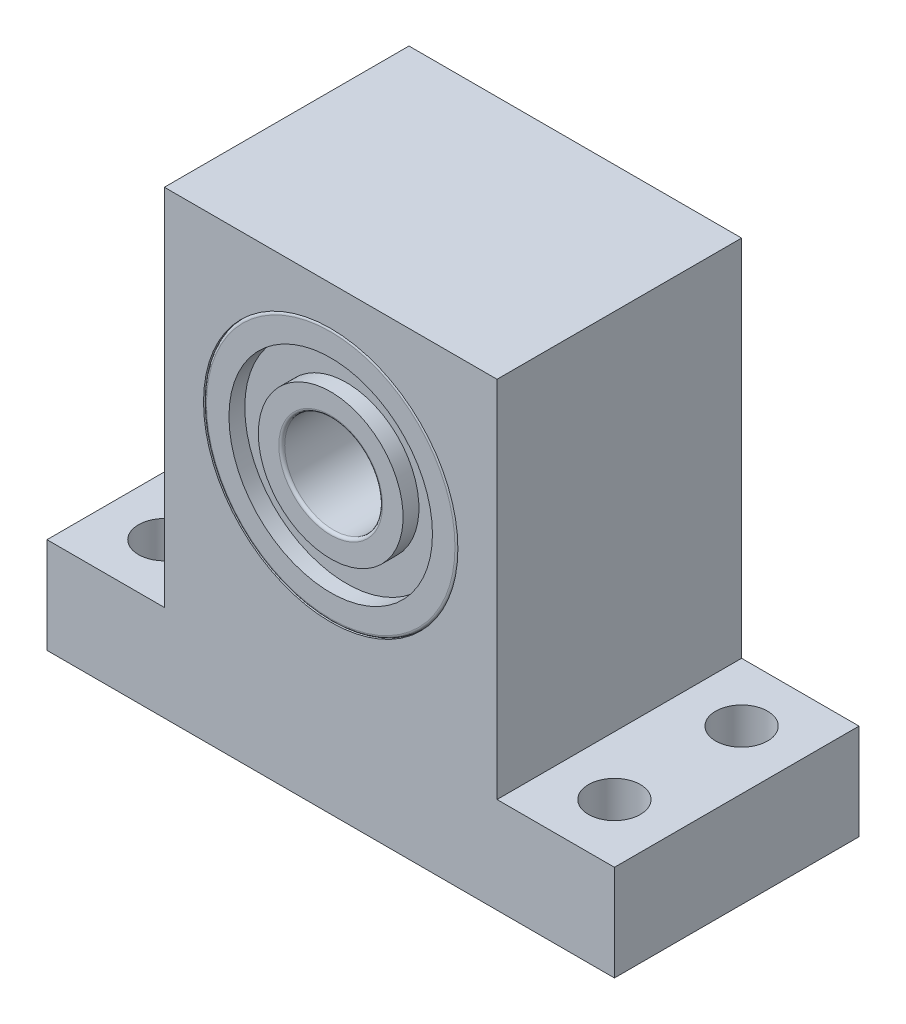
ISO-10303-21;
HEADER;
FILE_DESCRIPTION(('STEP AP214'),'2;1');
FILE_NAME('part.step','',(''),(''),'','','');
FILE_SCHEMA(('AUTOMOTIVE_DESIGN { 1 0 10303 214 1 1 1 1 }'));
ENDSEC;
DATA;
#1=APPLICATION_CONTEXT('core data for automotive mechanical design processes');
#2=APPLICATION_PROTOCOL_DEFINITION('international standard','automotive_design',2000,#1);
#3=PRODUCT_CONTEXT('',#1,'mechanical');
#4=PRODUCT('Part','Part','',(#3));
#5=PRODUCT_RELATED_PRODUCT_CATEGORY('part','',(#4));
#6=PRODUCT_DEFINITION_FORMATION('','',#4);
#7=PRODUCT_DEFINITION_CONTEXT('part definition',#1,'design');
#8=PRODUCT_DEFINITION('design','',#6,#7);
#9=PRODUCT_DEFINITION_SHAPE('','',#8);
#10=(LENGTH_UNIT() NAMED_UNIT(*) SI_UNIT(.MILLI.,.METRE.));
#11=(NAMED_UNIT(*) PLANE_ANGLE_UNIT() SI_UNIT($,.RADIAN.));
#12=(NAMED_UNIT(*) SI_UNIT($,.STERADIAN.) SOLID_ANGLE_UNIT());
#13=UNCERTAINTY_MEASURE_WITH_UNIT(LENGTH_MEASURE(1.E-05),#10,'distance_accuracy_value','');
#14=(GEOMETRIC_REPRESENTATION_CONTEXT(3) GLOBAL_UNCERTAINTY_ASSIGNED_CONTEXT((#13)) GLOBAL_UNIT_ASSIGNED_CONTEXT((#10,
#11,#12)) REPRESENTATION_CONTEXT('',''));
#15=CARTESIAN_POINT('',(0.,0.,0.));
#16=DIRECTION('',(0.,0.,1.));
#17=DIRECTION('',(1.,0.,0.));
#18=AXIS2_PLACEMENT_3D('',#15,#16,#17);
#19=CARTESIAN_POINT('',(0.,40.4,4.5));
#20=DIRECTION('',(0.,0.,-1.));
#21=DIRECTION('',(0.,-1.,0.));
#22=AXIS2_PLACEMENT_3D('',#19,#20,#21);
#23=PLANE('',#22);
#24=CARTESIAN_POINT('',(0.,30.,4.5));
#25=DIRECTION('',(0.,0.,-1.));
#26=DIRECTION('',(-1.,0.,0.));
#27=AXIS2_PLACEMENT_3D('',#24,#25,#26);
#28=CIRCLE('',#27,10.4);
#29=CARTESIAN_POINT('',(-10.4,30.,4.5));
#30=VERTEX_POINT('',#29);
#31=EDGE_CURVE('E212',#30,#30,#28,.T.);
#32=ORIENTED_EDGE('',*,*,#31,.F.);
#33=EDGE_LOOP('',(#32));
#34=FACE_BOUND('',#33,.T.);
#35=CARTESIAN_POINT('',(0.,30.,4.5));
#36=DIRECTION('',(0.,0.,-1.));
#37=DIRECTION('',(-1.,0.,0.));
#38=AXIS2_PLACEMENT_3D('',#35,#36,#37);
#39=CIRCLE('',#38,11.);
#40=CARTESIAN_POINT('',(-11.,30.,4.5));
#41=VERTEX_POINT('',#40);
#42=EDGE_CURVE('E245',#41,#41,#39,.T.);
#43=ORIENTED_EDGE('',*,*,#42,.T.);
#44=EDGE_LOOP('',(#43));
#45=FACE_BOUND('',#44,.T.);
#46=ADVANCED_FACE('F17',(#34,#45),#23,.T.);
#47=CARTESIAN_POINT('',(0.,30.,12.2));
#48=DIRECTION('',(0.,0.,-1.));
#49=DIRECTION('',(-1.,0.,0.));
#50=AXIS2_PLACEMENT_3D('',#47,#48,#49);
#51=TOROIDAL_SURFACE('',#50,12.7,0.3);
#52=CARTESIAN_POINT('',(0.,30.,12.2));
#53=DIRECTION('',(0.,0.,-1.));
#54=DIRECTION('',(-1.,0.,0.));
#55=AXIS2_PLACEMENT_3D('',#52,#53,#54);
#56=CIRCLE('',#55,13.);
#57=CARTESIAN_POINT('',(-13.,30.,12.2));
#58=VERTEX_POINT('',#57);
#59=EDGE_CURVE('E250',#58,#58,#56,.T.);
#60=ORIENTED_EDGE('',*,*,#59,.F.);
#61=EDGE_LOOP('',(#60));
#62=FACE_BOUND('',#61,.T.);
#63=CARTESIAN_POINT('',(0.,30.,12.5));
#64=DIRECTION('',(0.,0.,-1.));
#65=DIRECTION('',(-1.,0.,0.));
#66=AXIS2_PLACEMENT_3D('',#63,#64,#65);
#67=CIRCLE('',#66,12.7);
#68=CARTESIAN_POINT('',(-12.7,30.,12.5));
#69=VERTEX_POINT('',#68);
#70=EDGE_CURVE('E175',#69,#69,#67,.T.);
#71=ORIENTED_EDGE('',*,*,#70,.T.);
#72=EDGE_LOOP('',(#71));
#73=FACE_BOUND('',#72,.T.);
#74=ADVANCED_FACE('F489',(#62,#73),#51,.T.);
#75=CARTESIAN_POINT('',(0.,42.7,12.5));
#76=DIRECTION('',(0.,0.,1.));
#77=DIRECTION('',(1.,0.,0.));
#78=AXIS2_PLACEMENT_3D('',#75,#76,#77);
#79=PLANE('',#78);
#80=ORIENTED_EDGE('',*,*,#70,.F.);
#81=EDGE_LOOP('',(#80));
#82=FACE_BOUND('',#81,.T.);
#83=CARTESIAN_POINT('',(0.,30.,12.5));
#84=DIRECTION('',(0.,0.,-1.));
#85=DIRECTION('',(-1.,0.,0.));
#86=AXIS2_PLACEMENT_3D('',#83,#84,#85);
#87=CIRCLE('',#86,10.4);
#88=CARTESIAN_POINT('',(-10.4,30.,12.5));
#89=VERTEX_POINT('',#88);
#90=EDGE_CURVE('E178',#89,#89,#87,.T.);
#91=ORIENTED_EDGE('',*,*,#90,.T.);
#92=EDGE_LOOP('',(#91));
#93=FACE_BOUND('',#92,.T.);
#94=ADVANCED_FACE('F495',(#82,#93),#79,.T.);
#95=CARTESIAN_POINT('',(0.,30.,-50.));
#96=DIRECTION('',(0.,0.,-1.));
#97=DIRECTION('',(-1.,0.,0.));
#98=AXIS2_PLACEMENT_3D('',#95,#96,#97);
#99=CYLINDRICAL_SURFACE('',#98,10.4);
#100=ORIENTED_EDGE('',*,*,#90,.F.);
#101=EDGE_LOOP('',(#100));
#102=FACE_BOUND('',#101,.T.);
#103=CARTESIAN_POINT('',(0.,30.,10.882));
#104=DIRECTION('',(0.,0.,-1.));
#105=DIRECTION('',(-1.,0.,0.));
#106=AXIS2_PLACEMENT_3D('',#103,#104,#105);
#107=CIRCLE('',#106,10.4);
#108=CARTESIAN_POINT('',(-10.4,30.,10.882));
#109=VERTEX_POINT('',#108);
#110=EDGE_CURVE('E181',#109,#109,#107,.T.);
#111=ORIENTED_EDGE('',*,*,#110,.T.);
#112=EDGE_LOOP('',(#111));
#113=FACE_BOUND('',#112,.T.);
#114=ADVANCED_FACE('F555',(#102,#113),#99,.F.);
#115=CARTESIAN_POINT('',(0.,40.4,10.882));
#116=DIRECTION('',(0.,0.,1.));
#117=DIRECTION('',(1.,0.,0.));
#118=AXIS2_PLACEMENT_3D('',#115,#116,#117);
#119=PLANE('',#118);
#120=ORIENTED_EDGE('',*,*,#110,.F.);
#121=EDGE_LOOP('',(#120));
#122=FACE_BOUND('',#121,.T.);
#123=CARTESIAN_POINT('',(0.,30.,10.882));
#124=DIRECTION('',(0.,0.,-1.));
#125=DIRECTION('',(-1.,0.,0.));
#126=AXIS2_PLACEMENT_3D('',#123,#124,#125);
#127=CIRCLE('',#126,7.4);
#128=CARTESIAN_POINT('',(-7.4,30.,10.882));
#129=VERTEX_POINT('',#128);
#130=EDGE_CURVE('E182',#129,#129,#127,.T.);
#131=ORIENTED_EDGE('',*,*,#130,.T.);
#132=EDGE_LOOP('',(#131));
#133=FACE_BOUND('',#132,.T.);
#134=ADVANCED_FACE('F551',(#122,#133),#119,.T.);
#135=CARTESIAN_POINT('',(0.,30.,-50.));
#136=DIRECTION('',(0.,0.,-1.));
#137=DIRECTION('',(-1.,0.,0.));
#138=AXIS2_PLACEMENT_3D('',#135,#136,#137);
#139=CYLINDRICAL_SURFACE('',#138,7.4);
#140=ORIENTED_EDGE('',*,*,#130,.F.);
#141=EDGE_LOOP('',(#140));
#142=FACE_BOUND('',#141,.T.);
#143=CARTESIAN_POINT('',(0.,30.,12.5));
#144=DIRECTION('',(0.,0.,-1.));
#145=DIRECTION('',(-1.,0.,0.));
#146=AXIS2_PLACEMENT_3D('',#143,#144,#145);
#147=CIRCLE('',#146,7.4);
#148=CARTESIAN_POINT('',(-7.4,30.,12.5));
#149=VERTEX_POINT('',#148);
#150=EDGE_CURVE('E185',#149,#149,#147,.T.);
#151=ORIENTED_EDGE('',*,*,#150,.T.);
#152=EDGE_LOOP('',(#151));
#153=FACE_BOUND('',#152,.T.);
#154=ADVANCED_FACE('F554',(#142,#153),#139,.T.);
#155=CARTESIAN_POINT('',(0.,37.4,12.5));
#156=DIRECTION('',(0.,0.,1.));
#157=DIRECTION('',(1.,0.,0.));
#158=AXIS2_PLACEMENT_3D('',#155,#156,#157);
#159=PLANE('',#158);
#160=ORIENTED_EDGE('',*,*,#150,.F.);
#161=EDGE_LOOP('',(#160));
#162=FACE_BOUND('',#161,.T.);
#163=CARTESIAN_POINT('',(0.,30.,12.5));
#164=DIRECTION('',(0.,0.,-1.));
#165=DIRECTION('',(-1.,0.,0.));
#166=AXIS2_PLACEMENT_3D('',#163,#164,#165);
#167=CIRCLE('',#166,5.3);
#168=CARTESIAN_POINT('',(-5.3,30.,12.5));
#169=VERTEX_POINT('',#168);
#170=EDGE_CURVE('E189',#169,#169,#167,.T.);
#171=ORIENTED_EDGE('',*,*,#170,.T.);
#172=EDGE_LOOP('',(#171));
#173=FACE_BOUND('',#172,.T.);
#174=ADVANCED_FACE('F571',(#162,#173),#159,.T.);
#175=CARTESIAN_POINT('',(0.,30.,12.2));
#176=DIRECTION('',(0.,0.,-1.));
#177=DIRECTION('',(-1.,0.,0.));
#178=AXIS2_PLACEMENT_3D('',#175,#176,#177);
#179=TOROIDAL_SURFACE('',#178,5.3,0.299999999999991);
#180=ORIENTED_EDGE('',*,*,#170,.F.);
#181=EDGE_LOOP('',(#180));
#182=FACE_BOUND('',#181,.T.);
#183=CARTESIAN_POINT('',(0.,30.,12.2));
#184=DIRECTION('',(0.,0.,-1.));
#185=DIRECTION('',(-1.,0.,0.));
#186=AXIS2_PLACEMENT_3D('',#183,#184,#185);
#187=CIRCLE('',#186,5.);
#188=CARTESIAN_POINT('',(-5.,30.,12.2));
#189=VERTEX_POINT('',#188);
#190=EDGE_CURVE('E192',#189,#189,#187,.T.);
#191=ORIENTED_EDGE('',*,*,#190,.T.);
#192=EDGE_LOOP('',(#191));
#193=FACE_BOUND('',#192,.T.);
#194=ADVANCED_FACE('F567',(#182,#193),#179,.T.);
#195=CARTESIAN_POINT('',(0.,30.,-50.));
#196=DIRECTION('',(0.,0.,-1.));
#197=DIRECTION('',(-1.,0.,0.));
#198=AXIS2_PLACEMENT_3D('',#195,#196,#197);
#199=CYLINDRICAL_SURFACE('',#198,5.);
#200=ORIENTED_EDGE('',*,*,#190,.F.);
#201=EDGE_LOOP('',(#200));
#202=FACE_BOUND('',#201,.T.);
#203=CARTESIAN_POINT('',(0.,30.,4.8));
#204=DIRECTION('',(0.,0.,-1.));
#205=DIRECTION('',(-1.,0.,0.));
#206=AXIS2_PLACEMENT_3D('',#203,#204,#205);
#207=CIRCLE('',#206,5.);
#208=CARTESIAN_POINT('',(-5.,30.,4.8));
#209=VERTEX_POINT('',#208);
#210=EDGE_CURVE('E196',#209,#209,#207,.T.);
#211=ORIENTED_EDGE('',*,*,#210,.T.);
#212=EDGE_LOOP('',(#211));
#213=FACE_BOUND('',#212,.T.);
#214=ADVANCED_FACE('F563',(#202,#213),#199,.F.);
#215=CARTESIAN_POINT('',(0.,30.,4.8));
#216=DIRECTION('',(0.,0.,-1.));
#217=DIRECTION('',(-1.,0.,0.));
#218=AXIS2_PLACEMENT_3D('',#215,#216,#217);
#219=TOROIDAL_SURFACE('',#218,5.3,0.299999999999988);
#220=ORIENTED_EDGE('',*,*,#210,.F.);
#221=EDGE_LOOP('',(#220));
#222=FACE_BOUND('',#221,.T.);
#223=CARTESIAN_POINT('',(0.,30.,4.5));
#224=DIRECTION('',(0.,0.,-1.));
#225=DIRECTION('',(-1.,0.,0.));
#226=AXIS2_PLACEMENT_3D('',#223,#224,#225);
#227=CIRCLE('',#226,5.3);
#228=CARTESIAN_POINT('',(-5.3,30.,4.5));
#229=VERTEX_POINT('',#228);
#230=EDGE_CURVE('E199',#229,#229,#227,.T.);
#231=ORIENTED_EDGE('',*,*,#230,.T.);
#232=EDGE_LOOP('',(#231));
#233=FACE_BOUND('',#232,.T.);
#234=ADVANCED_FACE('F559',(#222,#233),#219,.T.);
#235=CARTESIAN_POINT('',(0.,35.3,4.5));
#236=DIRECTION('',(0.,0.,-1.));
#237=DIRECTION('',(0.,-1.,0.));
#238=AXIS2_PLACEMENT_3D('',#235,#236,#237);
#239=PLANE('',#238);
#240=ORIENTED_EDGE('',*,*,#230,.F.);
#241=EDGE_LOOP('',(#240));
#242=FACE_BOUND('',#241,.T.);
#243=CARTESIAN_POINT('',(0.,30.,4.5));
#244=DIRECTION('',(0.,0.,-1.));
#245=DIRECTION('',(-1.,0.,0.));
#246=AXIS2_PLACEMENT_3D('',#243,#244,#245);
#247=CIRCLE('',#246,7.4);
#248=CARTESIAN_POINT('',(-7.4,30.,4.5));
#249=VERTEX_POINT('',#248);
#250=EDGE_CURVE('E203',#249,#249,#247,.T.);
#251=ORIENTED_EDGE('',*,*,#250,.T.);
#252=EDGE_LOOP('',(#251));
#253=FACE_BOUND('',#252,.T.);
#254=ADVANCED_FACE('F549',(#242,#253),#239,.T.);
#255=CARTESIAN_POINT('',(0.,30.,-50.));
#256=DIRECTION('',(0.,0.,-1.));
#257=DIRECTION('',(-1.,0.,0.));
#258=AXIS2_PLACEMENT_3D('',#255,#256,#257);
#259=CYLINDRICAL_SURFACE('',#258,7.4);
#260=ORIENTED_EDGE('',*,*,#250,.F.);
#261=EDGE_LOOP('',(#260));
#262=FACE_BOUND('',#261,.T.);
#263=CARTESIAN_POINT('',(0.,30.,6.119));
#264=DIRECTION('',(0.,0.,-1.));
#265=DIRECTION('',(-1.,0.,0.));
#266=AXIS2_PLACEMENT_3D('',#263,#264,#265);
#267=CIRCLE('',#266,7.4);
#268=CARTESIAN_POINT('',(-7.4,30.,6.119));
#269=VERTEX_POINT('',#268);
#270=EDGE_CURVE('E206',#269,#269,#267,.T.);
#271=ORIENTED_EDGE('',*,*,#270,.T.);
#272=EDGE_LOOP('',(#271));
#273=FACE_BOUND('',#272,.T.);
#274=ADVANCED_FACE('F545',(#262,#273),#259,.T.);
#275=CARTESIAN_POINT('',(0.,37.4,6.119));
#276=DIRECTION('',(0.,0.,-1.));
#277=DIRECTION('',(0.,-1.,0.));
#278=AXIS2_PLACEMENT_3D('',#275,#276,#277);
#279=PLANE('',#278);
#280=ORIENTED_EDGE('',*,*,#270,.F.);
#281=EDGE_LOOP('',(#280));
#282=FACE_BOUND('',#281,.T.);
#283=CARTESIAN_POINT('',(0.,30.,6.119));
#284=DIRECTION('',(0.,0.,-1.));
#285=DIRECTION('',(-1.,0.,0.));
#286=AXIS2_PLACEMENT_3D('',#283,#284,#285);
#287=CIRCLE('',#286,10.4);
#288=CARTESIAN_POINT('',(-10.4,30.,6.119));
#289=VERTEX_POINT('',#288);
#290=EDGE_CURVE('E209',#289,#289,#287,.T.);
#291=ORIENTED_EDGE('',*,*,#290,.T.);
#292=EDGE_LOOP('',(#291));
#293=FACE_BOUND('',#292,.T.);
#294=ADVANCED_FACE('F541',(#282,#293),#279,.T.);
#295=CARTESIAN_POINT('',(0.,30.,-50.));
#296=DIRECTION('',(0.,0.,-1.));
#297=DIRECTION('',(-1.,0.,0.));
#298=AXIS2_PLACEMENT_3D('',#295,#296,#297);
#299=CYLINDRICAL_SURFACE('',#298,10.4);
#300=ORIENTED_EDGE('',*,*,#290,.F.);
#301=EDGE_LOOP('',(#300));
#302=FACE_BOUND('',#301,.T.);
#303=ORIENTED_EDGE('',*,*,#31,.T.);
#304=EDGE_LOOP('',(#303));
#305=FACE_BOUND('',#304,.T.);
#306=ADVANCED_FACE('F537',(#302,#305),#299,.F.);
#307=CARTESIAN_POINT('',(0.,30.,-50.));
#308=DIRECTION('',(0.,0.,-1.));
#309=DIRECTION('',(-1.,0.,0.));
#310=AXIS2_PLACEMENT_3D('',#307,#308,#309);
#311=CYLINDRICAL_SURFACE('',#310,7.4);
#312=CARTESIAN_POINT('',(0.,30.,-6.119));
#313=DIRECTION('',(0.,0.,-1.));
#314=DIRECTION('',(-1.,0.,0.));
#315=AXIS2_PLACEMENT_3D('',#312,#313,#314);
#316=CIRCLE('',#315,7.4);
#317=CARTESIAN_POINT('',(-7.4,30.,-6.119));
#318=VERTEX_POINT('',#317);
#319=EDGE_CURVE('E215',#318,#318,#316,.T.);
#320=ORIENTED_EDGE('',*,*,#319,.F.);
#321=EDGE_LOOP('',(#320));
#322=FACE_BOUND('',#321,.T.);
#323=CARTESIAN_POINT('',(0.,30.,-4.5));
#324=DIRECTION('',(0.,0.,-1.));
#325=DIRECTION('',(-1.,0.,0.));
#326=AXIS2_PLACEMENT_3D('',#323,#324,#325);
#327=CIRCLE('',#326,7.4);
#328=CARTESIAN_POINT('',(-7.4,30.,-4.5));
#329=VERTEX_POINT('',#328);
#330=EDGE_CURVE('E236',#329,#329,#327,.T.);
#331=ORIENTED_EDGE('',*,*,#330,.T.);
#332=EDGE_LOOP('',(#331));
#333=FACE_BOUND('',#332,.T.);
#334=ADVANCED_FACE('F540',(#322,#333),#311,.T.);
#335=CARTESIAN_POINT('',(0.,40.4,-6.119));
#336=DIRECTION('',(0.,0.,1.));
#337=DIRECTION('',(1.,0.,0.));
#338=AXIS2_PLACEMENT_3D('',#335,#336,#337);
#339=PLANE('',#338);
#340=CARTESIAN_POINT('',(0.,30.,-6.119));
#341=DIRECTION('',(0.,0.,-1.));
#342=DIRECTION('',(-1.,0.,0.));
#343=AXIS2_PLACEMENT_3D('',#340,#341,#342);
#344=CIRCLE('',#343,10.4);
#345=CARTESIAN_POINT('',(-10.4,30.,-6.119));
#346=VERTEX_POINT('',#345);
#347=EDGE_CURVE('E218',#346,#346,#344,.T.);
#348=ORIENTED_EDGE('',*,*,#347,.F.);
#349=EDGE_LOOP('',(#348));
#350=FACE_BOUND('',#349,.T.);
#351=ORIENTED_EDGE('',*,*,#319,.T.);
#352=EDGE_LOOP('',(#351));
#353=FACE_BOUND('',#352,.T.);
#354=ADVANCED_FACE('F535',(#350,#353),#339,.T.);
#355=CARTESIAN_POINT('',(0.,30.,-50.));
#356=DIRECTION('',(0.,0.,-1.));
#357=DIRECTION('',(-1.,0.,0.));
#358=AXIS2_PLACEMENT_3D('',#355,#356,#357);
#359=CYLINDRICAL_SURFACE('',#358,10.4);
#360=CARTESIAN_POINT('',(0.,30.,-4.5));
#361=DIRECTION('',(0.,0.,-1.));
#362=DIRECTION('',(-1.,0.,0.));
#363=AXIS2_PLACEMENT_3D('',#360,#361,#362);
#364=CIRCLE('',#363,10.4);
#365=CARTESIAN_POINT('',(-10.4,30.,-4.5));
#366=VERTEX_POINT('',#365);
#367=EDGE_CURVE('E242',#366,#366,#364,.T.);
#368=ORIENTED_EDGE('',*,*,#367,.F.);
#369=EDGE_LOOP('',(#368));
#370=FACE_BOUND('',#369,.T.);
#371=ORIENTED_EDGE('',*,*,#347,.T.);
#372=EDGE_LOOP('',(#371));
#373=FACE_BOUND('',#372,.T.);
#374=ADVANCED_FACE('F451',(#370,#373),#359,.F.);
#375=CARTESIAN_POINT('',(0.,30.,-12.2));
#376=DIRECTION('',(0.,0.,-1.));
#377=DIRECTION('',(-1.,0.,0.));
#378=AXIS2_PLACEMENT_3D('',#375,#376,#377);
#379=TOROIDAL_SURFACE('',#378,12.7,0.3);
#380=CARTESIAN_POINT('',(0.,30.,-12.5));
#381=DIRECTION('',(0.,0.,-1.));
#382=DIRECTION('',(-1.,0.,0.));
#383=AXIS2_PLACEMENT_3D('',#380,#381,#382);
#384=CIRCLE('',#383,12.7);
#385=CARTESIAN_POINT('',(-12.7,30.,-12.5));
#386=VERTEX_POINT('',#385);
#387=EDGE_CURVE('E222',#386,#386,#384,.T.);
#388=ORIENTED_EDGE('',*,*,#387,.F.);
#389=EDGE_LOOP('',(#388));
#390=FACE_BOUND('',#389,.T.);
#391=CARTESIAN_POINT('',(0.,30.,-12.2));
#392=DIRECTION('',(0.,0.,-1.));
#393=DIRECTION('',(-1.,0.,0.));
#394=AXIS2_PLACEMENT_3D('',#391,#392,#393);
#395=CIRCLE('',#394,13.);
#396=CARTESIAN_POINT('',(-13.,30.,-12.2));
#397=VERTEX_POINT('',#396);
#398=EDGE_CURVE('E394',#397,#397,#395,.T.);
#399=ORIENTED_EDGE('',*,*,#398,.T.);
#400=EDGE_LOOP('',(#399));
#401=FACE_BOUND('',#400,.T.);
#402=ADVANCED_FACE('F445',(#390,#401),#379,.T.);
#403=CARTESIAN_POINT('',(0.,40.4,-12.5));
#404=DIRECTION('',(0.,0.,-1.));
#405=DIRECTION('',(0.,-1.,0.));
#406=AXIS2_PLACEMENT_3D('',#403,#404,#405);
#407=PLANE('',#406);
#408=CARTESIAN_POINT('',(0.,30.,-12.5));
#409=DIRECTION('',(0.,0.,-1.));
#410=DIRECTION('',(-1.,0.,0.));
#411=AXIS2_PLACEMENT_3D('',#408,#409,#410);
#412=CIRCLE('',#411,10.4);
#413=CARTESIAN_POINT('',(-10.4,30.,-12.5));
#414=VERTEX_POINT('',#413);
#415=EDGE_CURVE('E219',#414,#414,#412,.T.);
#416=ORIENTED_EDGE('',*,*,#415,.F.);
#417=EDGE_LOOP('',(#416));
#418=FACE_BOUND('',#417,.T.);
#419=ORIENTED_EDGE('',*,*,#387,.T.);
#420=EDGE_LOOP('',(#419));
#421=FACE_BOUND('',#420,.T.);
#422=ADVANCED_FACE('F439',(#418,#421),#407,.T.);
#423=CARTESIAN_POINT('',(0.,30.,-50.));
#424=DIRECTION('',(0.,0.,-1.));
#425=DIRECTION('',(-1.,0.,0.));
#426=AXIS2_PLACEMENT_3D('',#423,#424,#425);
#427=CYLINDRICAL_SURFACE('',#426,10.4);
#428=CARTESIAN_POINT('',(0.,30.,-10.882));
#429=DIRECTION('',(0.,0.,-1.));
#430=DIRECTION('',(-1.,0.,0.));
#431=AXIS2_PLACEMENT_3D('',#428,#429,#430);
#432=CIRCLE('',#431,10.4);
#433=CARTESIAN_POINT('',(-10.4,30.,-10.882));
#434=VERTEX_POINT('',#433);
#435=EDGE_CURVE('E223',#434,#434,#432,.T.);
#436=ORIENTED_EDGE('',*,*,#435,.F.);
#437=EDGE_LOOP('',(#436));
#438=FACE_BOUND('',#437,.T.);
#439=ORIENTED_EDGE('',*,*,#415,.T.);
#440=EDGE_LOOP('',(#439));
#441=FACE_BOUND('',#440,.T.);
#442=ADVANCED_FACE('F433',(#438,#441),#427,.F.);
#443=CARTESIAN_POINT('',(0.,37.4,-10.882));
#444=DIRECTION('',(0.,0.,-1.));
#445=DIRECTION('',(0.,-1.,0.));
#446=AXIS2_PLACEMENT_3D('',#443,#444,#445);
#447=PLANE('',#446);
#448=CARTESIAN_POINT('',(0.,30.,-10.882));
#449=DIRECTION('',(0.,0.,-1.));
#450=DIRECTION('',(-1.,0.,0.));
#451=AXIS2_PLACEMENT_3D('',#448,#449,#450);
#452=CIRCLE('',#451,7.4);
#453=CARTESIAN_POINT('',(-7.4,30.,-10.882));
#454=VERTEX_POINT('',#453);
#455=EDGE_CURVE('E229',#454,#454,#452,.T.);
#456=ORIENTED_EDGE('',*,*,#455,.F.);
#457=EDGE_LOOP('',(#456));
#458=FACE_BOUND('',#457,.T.);
#459=ORIENTED_EDGE('',*,*,#435,.T.);
#460=EDGE_LOOP('',(#459));
#461=FACE_BOUND('',#460,.T.);
#462=ADVANCED_FACE('F427',(#458,#461),#447,.T.);
#463=CARTESIAN_POINT('',(0.,30.,-50.));
#464=DIRECTION('',(0.,0.,-1.));
#465=DIRECTION('',(-1.,0.,0.));
#466=AXIS2_PLACEMENT_3D('',#463,#464,#465);
#467=CYLINDRICAL_SURFACE('',#466,7.4);
#468=CARTESIAN_POINT('',(0.,30.,-12.5));
#469=DIRECTION('',(0.,0.,-1.));
#470=DIRECTION('',(-1.,0.,0.));
#471=AXIS2_PLACEMENT_3D('',#468,#469,#470);
#472=CIRCLE('',#471,7.4);
#473=CARTESIAN_POINT('',(-7.4,30.,-12.5));
#474=VERTEX_POINT('',#473);
#475=EDGE_CURVE('E226',#474,#474,#472,.T.);
#476=ORIENTED_EDGE('',*,*,#475,.F.);
#477=EDGE_LOOP('',(#476));
#478=FACE_BOUND('',#477,.T.);
#479=ORIENTED_EDGE('',*,*,#455,.T.);
#480=EDGE_LOOP('',(#479));
#481=FACE_BOUND('',#480,.T.);
#482=ADVANCED_FACE('F421',(#478,#481),#467,.T.);
#483=CARTESIAN_POINT('',(0.,35.3,-12.5));
#484=DIRECTION('',(0.,0.,-1.));
#485=DIRECTION('',(0.,-1.,0.));
#486=AXIS2_PLACEMENT_3D('',#483,#484,#485);
#487=PLANE('',#486);
#488=CARTESIAN_POINT('',(0.,30.,-12.5));
#489=DIRECTION('',(0.,0.,-1.));
#490=DIRECTION('',(-1.,0.,0.));
#491=AXIS2_PLACEMENT_3D('',#488,#489,#490);
#492=CIRCLE('',#491,5.3);
#493=CARTESIAN_POINT('',(-5.3,30.,-12.5));
#494=VERTEX_POINT('',#493);
#495=EDGE_CURVE('E230',#494,#494,#492,.T.);
#496=ORIENTED_EDGE('',*,*,#495,.F.);
#497=EDGE_LOOP('',(#496));
#498=FACE_BOUND('',#497,.T.);
#499=ORIENTED_EDGE('',*,*,#475,.T.);
#500=EDGE_LOOP('',(#499));
#501=FACE_BOUND('',#500,.T.);
#502=ADVANCED_FACE('F415',(#498,#501),#487,.T.);
#503=CARTESIAN_POINT('',(0.,30.,-12.2));
#504=DIRECTION('',(0.,0.,-1.));
#505=DIRECTION('',(-1.,0.,0.));
#506=AXIS2_PLACEMENT_3D('',#503,#504,#505);
#507=TOROIDAL_SURFACE('',#506,5.3,0.299999999999988);
#508=CARTESIAN_POINT('',(0.,30.,-12.2));
#509=DIRECTION('',(0.,0.,-1.));
#510=DIRECTION('',(-1.,0.,0.));
#511=AXIS2_PLACEMENT_3D('',#508,#509,#510);
#512=CIRCLE('',#511,5.);
#513=CARTESIAN_POINT('',(-5.,30.,-12.2));
#514=VERTEX_POINT('',#513);
#515=EDGE_CURVE('E235',#514,#514,#512,.T.);
#516=ORIENTED_EDGE('',*,*,#515,.F.);
#517=EDGE_LOOP('',(#516));
#518=FACE_BOUND('',#517,.T.);
#519=ORIENTED_EDGE('',*,*,#495,.T.);
#520=EDGE_LOOP('',(#519));
#521=FACE_BOUND('',#520,.T.);
#522=ADVANCED_FACE('F412',(#518,#521),#507,.T.);
#523=CARTESIAN_POINT('',(0.,30.,-50.));
#524=DIRECTION('',(0.,0.,-1.));
#525=DIRECTION('',(-1.,0.,0.));
#526=AXIS2_PLACEMENT_3D('',#523,#524,#525);
#527=CYLINDRICAL_SURFACE('',#526,5.);
#528=CARTESIAN_POINT('',(0.,30.,-4.8));
#529=DIRECTION('',(0.,0.,-1.));
#530=DIRECTION('',(-1.,0.,0.));
#531=AXIS2_PLACEMENT_3D('',#528,#529,#530);
#532=CIRCLE('',#531,5.);
#533=CARTESIAN_POINT('',(-5.,30.,-4.8));
#534=VERTEX_POINT('',#533);
#535=EDGE_CURVE('E231',#534,#534,#532,.T.);
#536=ORIENTED_EDGE('',*,*,#535,.F.);
#537=EDGE_LOOP('',(#536));
#538=FACE_BOUND('',#537,.T.);
#539=ORIENTED_EDGE('',*,*,#515,.T.);
#540=EDGE_LOOP('',(#539));
#541=FACE_BOUND('',#540,.T.);
#542=ADVANCED_FACE('F410',(#538,#541),#527,.F.);
#543=CARTESIAN_POINT('',(0.,30.,-4.8));
#544=DIRECTION('',(0.,0.,-1.));
#545=DIRECTION('',(-1.,0.,0.));
#546=AXIS2_PLACEMENT_3D('',#543,#544,#545);
#547=TOROIDAL_SURFACE('',#546,5.3,0.299999999999987);
#548=CARTESIAN_POINT('',(0.,30.,-4.5));
#549=DIRECTION('',(0.,0.,-1.));
#550=DIRECTION('',(-1.,0.,0.));
#551=AXIS2_PLACEMENT_3D('',#548,#549,#550);
#552=CIRCLE('',#551,5.3);
#553=CARTESIAN_POINT('',(-5.3,30.,-4.5));
#554=VERTEX_POINT('',#553);
#555=EDGE_CURVE('E239',#554,#554,#552,.T.);
#556=ORIENTED_EDGE('',*,*,#555,.F.);
#557=EDGE_LOOP('',(#556));
#558=FACE_BOUND('',#557,.T.);
#559=ORIENTED_EDGE('',*,*,#535,.T.);
#560=EDGE_LOOP('',(#559));
#561=FACE_BOUND('',#560,.T.);
#562=ADVANCED_FACE('F673',(#558,#561),#547,.T.);
#563=CARTESIAN_POINT('',(0.,37.4,-4.5));
#564=DIRECTION('',(0.,0.,1.));
#565=DIRECTION('',(1.,0.,0.));
#566=AXIS2_PLACEMENT_3D('',#563,#564,#565);
#567=PLANE('',#566);
#568=ORIENTED_EDGE('',*,*,#330,.F.);
#569=EDGE_LOOP('',(#568));
#570=FACE_BOUND('',#569,.T.);
#571=ORIENTED_EDGE('',*,*,#555,.T.);
#572=EDGE_LOOP('',(#571));
#573=FACE_BOUND('',#572,.T.);
#574=ADVANCED_FACE('F669',(#570,#573),#567,.T.);
#575=CARTESIAN_POINT('',(0.,42.7,-4.5));
#576=DIRECTION('',(0.,0.,1.));
#577=DIRECTION('',(1.,0.,0.));
#578=AXIS2_PLACEMENT_3D('',#575,#576,#577);
#579=PLANE('',#578);
#580=CARTESIAN_POINT('',(0.,30.,-4.5));
#581=DIRECTION('',(0.,0.,-1.));
#582=DIRECTION('',(-1.,0.,0.));
#583=AXIS2_PLACEMENT_3D('',#580,#581,#582);
#584=CIRCLE('',#583,11.);
#585=CARTESIAN_POINT('',(-11.,30.,-4.5));
#586=VERTEX_POINT('',#585);
#587=EDGE_CURVE('E248',#586,#586,#584,.T.);
#588=ORIENTED_EDGE('',*,*,#587,.F.);
#589=EDGE_LOOP('',(#588));
#590=FACE_BOUND('',#589,.T.);
#591=ORIENTED_EDGE('',*,*,#367,.T.);
#592=EDGE_LOOP('',(#591));
#593=FACE_BOUND('',#592,.T.);
#594=ADVANCED_FACE('F662',(#590,#593),#579,.T.);
#595=CARTESIAN_POINT('',(0.,30.,-12.5));
#596=DIRECTION('',(0.,0.,-1.));
#597=DIRECTION('',(-1.,0.,0.));
#598=AXIS2_PLACEMENT_3D('',#595,#596,#597);
#599=CYLINDRICAL_SURFACE('',#598,11.);
#600=ORIENTED_EDGE('',*,*,#42,.F.);
#601=EDGE_LOOP('',(#600));
#602=FACE_BOUND('',#601,.T.);
#603=ORIENTED_EDGE('',*,*,#587,.T.);
#604=EDGE_LOOP('',(#603));
#605=FACE_BOUND('',#604,.T.);
#606=ADVANCED_FACE('F652',(#602,#605),#599,.F.);
#607=CARTESIAN_POINT('',(0.,30.,-12.5));
#608=DIRECTION('',(0.,0.,-1.));
#609=DIRECTION('',(-1.,0.,0.));
#610=AXIS2_PLACEMENT_3D('',#607,#608,#609);
#611=CYLINDRICAL_SURFACE('',#610,13.);
#612=CARTESIAN_POINT('',(0.,30.,12.5));
#613=DIRECTION('',(0.,0.,-1.));
#614=DIRECTION('',(-1.,0.,0.));
#615=AXIS2_PLACEMENT_3D('',#612,#613,#614);
#616=CIRCLE('',#615,13.);
#617=CARTESIAN_POINT('',(-13.,30.,12.5));
#618=VERTEX_POINT('',#617);
#619=EDGE_CURVE('E255',#618,#618,#616,.T.);
#620=ORIENTED_EDGE('',*,*,#619,.F.);
#621=EDGE_LOOP('',(#620));
#622=FACE_BOUND('',#621,.T.);
#623=ORIENTED_EDGE('',*,*,#59,.T.);
#624=EDGE_LOOP('',(#623));
#625=FACE_BOUND('',#624,.T.);
#626=ADVANCED_FACE('F648',(#622,#625),#611,.F.);
#627=CARTESIAN_POINT('',(-23.,9.8,6.5));
#628=DIRECTION('',(0.,-1.,0.));
#629=DIRECTION('',(0.,0.,-1.));
#630=AXIS2_PLACEMENT_3D('',#627,#628,#629);
#631=CYLINDRICAL_SURFACE('',#630,2.65);
#632=CARTESIAN_POINT('',(-23.,0.,6.5));
#633=DIRECTION('',(0.,1.,0.));
#634=DIRECTION('',(1.,0.,0.));
#635=AXIS2_PLACEMENT_3D('',#632,#633,#634);
#636=CIRCLE('',#635,2.65);
#637=CARTESIAN_POINT('',(-20.35,0.,6.5));
#638=VERTEX_POINT('',#637);
#639=EDGE_CURVE('E338',#638,#638,#636,.T.);
#640=ORIENTED_EDGE('',*,*,#639,.F.);
#641=EDGE_LOOP('',(#640));
#642=FACE_BOUND('',#641,.T.);
#643=CARTESIAN_POINT('',(-23.,9.8,6.5));
#644=DIRECTION('',(0.,1.,0.));
#645=DIRECTION('',(1.,0.,0.));
#646=AXIS2_PLACEMENT_3D('',#643,#644,#645);
#647=CIRCLE('',#646,2.65);
#648=CARTESIAN_POINT('',(-20.35,9.8,6.5));
#649=VERTEX_POINT('',#648);
#650=EDGE_CURVE('E385',#649,#649,#647,.T.);
#651=ORIENTED_EDGE('',*,*,#650,.T.);
#652=EDGE_LOOP('',(#651));
#653=FACE_BOUND('',#652,.T.);
#654=ADVANCED_FACE('F651',(#642,#653),#631,.F.);
#655=CARTESIAN_POINT('',(-23.,9.8,-6.5));
#656=DIRECTION('',(0.,-1.,0.));
#657=DIRECTION('',(0.,0.,-1.));
#658=AXIS2_PLACEMENT_3D('',#655,#656,#657);
#659=CYLINDRICAL_SURFACE('',#658,2.65);
#660=CARTESIAN_POINT('',(-23.,0.,-6.5));
#661=DIRECTION('',(0.,1.,0.));
#662=DIRECTION('',(1.,0.,0.));
#663=AXIS2_PLACEMENT_3D('',#660,#661,#662);
#664=CIRCLE('',#663,2.65);
#665=CARTESIAN_POINT('',(-20.35,0.,-6.5));
#666=VERTEX_POINT('',#665);
#667=EDGE_CURVE('E334',#666,#666,#664,.T.);
#668=ORIENTED_EDGE('',*,*,#667,.F.);
#669=EDGE_LOOP('',(#668));
#670=FACE_BOUND('',#669,.T.);
#671=CARTESIAN_POINT('',(-23.,9.8,-6.5));
#672=DIRECTION('',(0.,1.,0.));
#673=DIRECTION('',(1.,0.,0.));
#674=AXIS2_PLACEMENT_3D('',#671,#672,#673);
#675=CIRCLE('',#674,2.65);
#676=CARTESIAN_POINT('',(-20.35,9.8,-6.5));
#677=VERTEX_POINT('',#676);
#678=EDGE_CURVE('E380',#677,#677,#675,.T.);
#679=ORIENTED_EDGE('',*,*,#678,.T.);
#680=EDGE_LOOP('',(#679));
#681=FACE_BOUND('',#680,.T.);
#682=ADVANCED_FACE('F659',(#670,#681),#659,.F.);
#683=CARTESIAN_POINT('',(23.,9.8,6.5));
#684=DIRECTION('',(0.,-1.,0.));
#685=DIRECTION('',(0.,0.,-1.));
#686=AXIS2_PLACEMENT_3D('',#683,#684,#685);
#687=CYLINDRICAL_SURFACE('',#686,2.65);
#688=CARTESIAN_POINT('',(23.,0.,6.5));
#689=DIRECTION('',(0.,1.,0.));
#690=DIRECTION('',(1.,0.,0.));
#691=AXIS2_PLACEMENT_3D('',#688,#689,#690);
#692=CIRCLE('',#691,2.65);
#693=CARTESIAN_POINT('',(25.65,0.,6.5));
#694=VERTEX_POINT('',#693);
#695=EDGE_CURVE('E333',#694,#694,#692,.T.);
#696=ORIENTED_EDGE('',*,*,#695,.F.);
#697=EDGE_LOOP('',(#696));
#698=FACE_BOUND('',#697,.T.);
#699=CARTESIAN_POINT('',(23.,9.8,6.5));
#700=DIRECTION('',(0.,1.,0.));
#701=DIRECTION('',(1.,0.,0.));
#702=AXIS2_PLACEMENT_3D('',#699,#700,#701);
#703=CIRCLE('',#702,2.65);
#704=CARTESIAN_POINT('',(25.65,9.8,6.5));
#705=VERTEX_POINT('',#704);
#706=EDGE_CURVE('E298',#705,#705,#703,.T.);
#707=ORIENTED_EDGE('',*,*,#706,.T.);
#708=EDGE_LOOP('',(#707));
#709=FACE_BOUND('',#708,.T.);
#710=ADVANCED_FACE('F483',(#698,#709),#687,.F.);
#711=CARTESIAN_POINT('',(23.,9.8,-6.5));
#712=DIRECTION('',(0.,-1.,0.));
#713=DIRECTION('',(0.,0.,-1.));
#714=AXIS2_PLACEMENT_3D('',#711,#712,#713);
#715=CYLINDRICAL_SURFACE('',#714,2.65);
#716=CARTESIAN_POINT('',(23.,0.,-6.5));
#717=DIRECTION('',(0.,1.,0.));
#718=DIRECTION('',(1.,0.,0.));
#719=AXIS2_PLACEMENT_3D('',#716,#717,#718);
#720=CIRCLE('',#719,2.65);
#721=CARTESIAN_POINT('',(25.65,0.,-6.5));
#722=VERTEX_POINT('',#721);
#723=EDGE_CURVE('E329',#722,#722,#720,.T.);
#724=ORIENTED_EDGE('',*,*,#723,.F.);
#725=EDGE_LOOP('',(#724));
#726=FACE_BOUND('',#725,.T.);
#727=CARTESIAN_POINT('',(23.,9.8,-6.5));
#728=DIRECTION('',(0.,1.,0.));
#729=DIRECTION('',(1.,0.,0.));
#730=AXIS2_PLACEMENT_3D('',#727,#728,#729);
#731=CIRCLE('',#730,2.65);
#732=CARTESIAN_POINT('',(25.65,9.8,-6.5));
#733=VERTEX_POINT('',#732);
#734=EDGE_CURVE('E291',#733,#733,#731,.T.);
#735=ORIENTED_EDGE('',*,*,#734,.T.);
#736=EDGE_LOOP('',(#735));
#737=FACE_BOUND('',#736,.T.);
#738=ADVANCED_FACE('F472',(#726,#737),#715,.F.);
#739=CARTESIAN_POINT('',(0.,0.,-12.5));
#740=DIRECTION('',(0.,0.,1.));
#741=DIRECTION('',(1.,0.,0.));
#742=AXIS2_PLACEMENT_3D('',#739,#740,#741);
#743=PLANE('',#742);
#744=DIRECTION('',(-1.,0.,0.));
#745=VECTOR('',#744,1.);
#746=CARTESIAN_POINT('',(-17.,9.8,-12.5));
#747=LINE('',#746,#745);
#748=CARTESIAN_POINT('',(-17.,9.8,-12.5));
#749=VERTEX_POINT('',#748);
#750=CARTESIAN_POINT('',(-29.,9.8,-12.5));
#751=VERTEX_POINT('',#750);
#752=EDGE_CURVE('E384',#749,#751,#747,.T.);
#753=ORIENTED_EDGE('',*,*,#752,.F.);
#754=DIRECTION('',(0.,-1.,0.));
#755=VECTOR('',#754,1.);
#756=CARTESIAN_POINT('',(-17.,47.,-12.5));
#757=LINE('',#756,#755);
#758=CARTESIAN_POINT('',(-17.,47.,-12.5));
#759=VERTEX_POINT('',#758);
#760=EDGE_CURVE('E263',#759,#749,#757,.T.);
#761=ORIENTED_EDGE('',*,*,#760,.F.);
#762=DIRECTION('',(-1.,0.,0.));
#763=VECTOR('',#762,1.);
#764=CARTESIAN_POINT('',(17.,47.,-12.5));
#765=LINE('',#764,#763);
#766=CARTESIAN_POINT('',(17.,47.,-12.5));
#767=VERTEX_POINT('',#766);
#768=EDGE_CURVE('E268',#767,#759,#765,.T.);
#769=ORIENTED_EDGE('',*,*,#768,.F.);
#770=DIRECTION('',(0.,1.,0.));
#771=VECTOR('',#770,1.);
#772=CARTESIAN_POINT('',(17.,9.8,-12.5));
#773=LINE('',#772,#771);
#774=CARTESIAN_POINT('',(17.,9.8,-12.5));
#775=VERTEX_POINT('',#774);
#776=EDGE_CURVE('E278',#775,#767,#773,.T.);
#777=ORIENTED_EDGE('',*,*,#776,.F.);
#778=DIRECTION('',(-1.,0.,0.));
#779=VECTOR('',#778,1.);
#780=CARTESIAN_POINT('',(29.,9.8,-12.5));
#781=LINE('',#780,#779);
#782=CARTESIAN_POINT('',(29.,9.8,-12.5));
#783=VERTEX_POINT('',#782);
#784=EDGE_CURVE('E284',#783,#775,#781,.T.);
#785=ORIENTED_EDGE('',*,*,#784,.F.);
#786=DIRECTION('',(0.,1.,0.));
#787=VECTOR('',#786,1.);
#788=CARTESIAN_POINT('',(29.,0.,-12.5));
#789=LINE('',#788,#787);
#790=CARTESIAN_POINT('',(29.,0.,-12.5));
#791=VERTEX_POINT('',#790);
#792=EDGE_CURVE('E310',#791,#783,#789,.T.);
#793=ORIENTED_EDGE('',*,*,#792,.F.);
#794=DIRECTION('',(1.,0.,0.));
#795=VECTOR('',#794,1.);
#796=CARTESIAN_POINT('',(-29.,0.,-12.5));
#797=LINE('',#796,#795);
#798=CARTESIAN_POINT('',(-29.,0.,-12.5));
#799=VERTEX_POINT('',#798);
#800=EDGE_CURVE('E325',#799,#791,#797,.T.);
#801=ORIENTED_EDGE('',*,*,#800,.F.);
#802=DIRECTION('',(0.,-1.,0.));
#803=VECTOR('',#802,1.);
#804=CARTESIAN_POINT('',(-29.,9.8,-12.5));
#805=LINE('',#804,#803);
#806=EDGE_CURVE('E358',#751,#799,#805,.T.);
#807=ORIENTED_EDGE('',*,*,#806,.F.);
#808=EDGE_LOOP('',(#753,#761,#769,#777,#785,#793,#801,#807));
#809=FACE_BOUND('',#808,.T.);
#810=CARTESIAN_POINT('',(0.,30.,-12.5));
#811=DIRECTION('',(0.,0.,-1.));
#812=DIRECTION('',(-1.,0.,0.));
#813=AXIS2_PLACEMENT_3D('',#810,#811,#812);
#814=CIRCLE('',#813,13.);
#815=CARTESIAN_POINT('',(-13.,30.,-12.5));
#816=VERTEX_POINT('',#815);
#817=EDGE_CURVE('E398',#816,#816,#814,.T.);
#818=ORIENTED_EDGE('',*,*,#817,.F.);
#819=EDGE_LOOP('',(#818));
#820=FACE_BOUND('',#819,.T.);
#821=ADVANCED_FACE('F469',(#809,#820),#743,.F.);
#822=CARTESIAN_POINT('',(0.,0.,12.5));
#823=DIRECTION('',(0.,0.,1.));
#824=DIRECTION('',(1.,0.,0.));
#825=AXIS2_PLACEMENT_3D('',#822,#823,#824);
#826=PLANE('',#825);
#827=DIRECTION('',(-1.,0.,0.));
#828=VECTOR('',#827,1.);
#829=CARTESIAN_POINT('',(-17.,9.8,12.5));
#830=LINE('',#829,#828);
#831=CARTESIAN_POINT('',(-17.,9.8,12.5));
#832=VERTEX_POINT('',#831);
#833=CARTESIAN_POINT('',(-29.,9.8,12.5));
#834=VERTEX_POINT('',#833);
#835=EDGE_CURVE('E370',#832,#834,#830,.T.);
#836=ORIENTED_EDGE('',*,*,#835,.T.);
#837=DIRECTION('',(0.,-1.,0.));
#838=VECTOR('',#837,1.);
#839=CARTESIAN_POINT('',(-29.,9.8,12.5));
#840=LINE('',#839,#838);
#841=CARTESIAN_POINT('',(-29.,0.,12.5));
#842=VERTEX_POINT('',#841);
#843=EDGE_CURVE('E345',#834,#842,#840,.T.);
#844=ORIENTED_EDGE('',*,*,#843,.T.);
#845=DIRECTION('',(1.,0.,0.));
#846=VECTOR('',#845,1.);
#847=CARTESIAN_POINT('',(-29.,0.,12.5));
#848=LINE('',#847,#846);
#849=CARTESIAN_POINT('',(29.,0.,12.5));
#850=VERTEX_POINT('',#849);
#851=EDGE_CURVE('E314',#842,#850,#848,.T.);
#852=ORIENTED_EDGE('',*,*,#851,.T.);
#853=DIRECTION('',(0.,1.,0.));
#854=VECTOR('',#853,1.);
#855=CARTESIAN_POINT('',(29.,0.,12.5));
#856=LINE('',#855,#854);
#857=CARTESIAN_POINT('',(29.,9.8,12.5));
#858=VERTEX_POINT('',#857);
#859=EDGE_CURVE('E302',#850,#858,#856,.T.);
#860=ORIENTED_EDGE('',*,*,#859,.T.);
#861=DIRECTION('',(-1.,0.,0.));
#862=VECTOR('',#861,1.);
#863=CARTESIAN_POINT('',(29.,9.8,12.5));
#864=LINE('',#863,#862);
#865=CARTESIAN_POINT('',(17.,9.8,12.5));
#866=VERTEX_POINT('',#865);
#867=EDGE_CURVE('E283',#858,#866,#864,.T.);
#868=ORIENTED_EDGE('',*,*,#867,.T.);
#869=DIRECTION('',(0.,1.,0.));
#870=VECTOR('',#869,1.);
#871=CARTESIAN_POINT('',(17.,9.8,12.5));
#872=LINE('',#871,#870);
#873=CARTESIAN_POINT('',(17.,47.,12.5));
#874=VERTEX_POINT('',#873);
#875=EDGE_CURVE('E273',#866,#874,#872,.T.);
#876=ORIENTED_EDGE('',*,*,#875,.T.);
#877=DIRECTION('',(-1.,0.,0.));
#878=VECTOR('',#877,1.);
#879=CARTESIAN_POINT('',(17.,47.,12.5));
#880=LINE('',#879,#878);
#881=CARTESIAN_POINT('',(-17.,47.,12.5));
#882=VERTEX_POINT('',#881);
#883=EDGE_CURVE('E266',#874,#882,#880,.T.);
#884=ORIENTED_EDGE('',*,*,#883,.T.);
#885=DIRECTION('',(0.,-1.,0.));
#886=VECTOR('',#885,1.);
#887=CARTESIAN_POINT('',(-17.,47.,12.5));
#888=LINE('',#887,#886);
#889=EDGE_CURVE('E259',#882,#832,#888,.T.);
#890=ORIENTED_EDGE('',*,*,#889,.T.);
#891=EDGE_LOOP('',(#836,#844,#852,#860,#868,#876,#884,#890));
#892=FACE_BOUND('',#891,.T.);
#893=ORIENTED_EDGE('',*,*,#619,.T.);
#894=EDGE_LOOP('',(#893));
#895=FACE_BOUND('',#894,.T.);
#896=ADVANCED_FACE('F471',(#892,#895),#826,.T.);
#897=CARTESIAN_POINT('',(-17.,47.,12.5));
#898=DIRECTION('',(1.,0.,0.));
#899=DIRECTION('',(0.,1.,0.));
#900=AXIS2_PLACEMENT_3D('',#897,#898,#899);
#901=PLANE('',#900);
#902=ORIENTED_EDGE('',*,*,#760,.T.);
#903=DIRECTION('',(0.,0.,-1.));
#904=VECTOR('',#903,1.);
#905=CARTESIAN_POINT('',(-17.,9.8,12.5));
#906=LINE('',#905,#904);
#907=EDGE_CURVE('E364',#832,#749,#906,.T.);
#908=ORIENTED_EDGE('',*,*,#907,.F.);
#909=ORIENTED_EDGE('',*,*,#889,.F.);
#910=DIRECTION('',(0.,0.,-1.));
#911=VECTOR('',#910,1.);
#912=CARTESIAN_POINT('',(-17.,47.,12.5));
#913=LINE('',#912,#911);
#914=EDGE_CURVE('E272',#882,#759,#913,.T.);
#915=ORIENTED_EDGE('',*,*,#914,.T.);
#916=EDGE_LOOP('',(#902,#908,#909,#915));
#917=FACE_BOUND('',#916,.T.);
#918=ADVANCED_FACE('F480',(#917),#901,.F.);
#919=CARTESIAN_POINT('',(17.,47.,12.5));
#920=DIRECTION('',(0.,-1.,0.));
#921=DIRECTION('',(0.,0.,-1.));
#922=AXIS2_PLACEMENT_3D('',#919,#920,#921);
#923=PLANE('',#922);
#924=ORIENTED_EDGE('',*,*,#768,.T.);
#925=ORIENTED_EDGE('',*,*,#914,.F.);
#926=ORIENTED_EDGE('',*,*,#883,.F.);
#927=DIRECTION('',(0.,0.,-1.));
#928=VECTOR('',#927,1.);
#929=CARTESIAN_POINT('',(17.,47.,12.5));
#930=LINE('',#929,#928);
#931=EDGE_CURVE('E274',#874,#767,#930,.T.);
#932=ORIENTED_EDGE('',*,*,#931,.T.);
#933=EDGE_LOOP('',(#924,#925,#926,#932));
#934=FACE_BOUND('',#933,.T.);
#935=ADVANCED_FACE('F780',(#934),#923,.F.);
#936=CARTESIAN_POINT('',(17.,9.8,12.5));
#937=DIRECTION('',(-1.,0.,0.));
#938=DIRECTION('',(0.,0.,1.));
#939=AXIS2_PLACEMENT_3D('',#936,#937,#938);
#940=PLANE('',#939);
#941=ORIENTED_EDGE('',*,*,#776,.T.);
#942=ORIENTED_EDGE('',*,*,#931,.F.);
#943=ORIENTED_EDGE('',*,*,#875,.F.);
#944=DIRECTION('',(0.,0.,-1.));
#945=VECTOR('',#944,1.);
#946=CARTESIAN_POINT('',(17.,9.8,12.5));
#947=LINE('',#946,#945);
#948=EDGE_CURVE('E279',#866,#775,#947,.T.);
#949=ORIENTED_EDGE('',*,*,#948,.T.);
#950=EDGE_LOOP('',(#941,#942,#943,#949));
#951=FACE_BOUND('',#950,.T.);
#952=ADVANCED_FACE('F758',(#951),#940,.F.);
#953=CARTESIAN_POINT('',(29.,9.8,12.5));
#954=DIRECTION('',(0.,-1.,0.));
#955=DIRECTION('',(0.,0.,-1.));
#956=AXIS2_PLACEMENT_3D('',#953,#954,#955);
#957=PLANE('',#956);
#958=ORIENTED_EDGE('',*,*,#784,.T.);
#959=ORIENTED_EDGE('',*,*,#948,.F.);
#960=ORIENTED_EDGE('',*,*,#867,.F.);
#961=DIRECTION('',(0.,0.,-1.));
#962=VECTOR('',#961,1.);
#963=CARTESIAN_POINT('',(29.,9.8,12.5));
#964=LINE('',#963,#962);
#965=EDGE_CURVE('E306',#858,#783,#964,.T.);
#966=ORIENTED_EDGE('',*,*,#965,.T.);
#967=EDGE_LOOP('',(#958,#959,#960,#966));
#968=FACE_BOUND('',#967,.T.);
#969=ORIENTED_EDGE('',*,*,#734,.F.);
#970=EDGE_LOOP('',(#969));
#971=FACE_BOUND('',#970,.T.);
#972=ORIENTED_EDGE('',*,*,#706,.F.);
#973=EDGE_LOOP('',(#972));
#974=FACE_BOUND('',#973,.T.);
#975=ADVANCED_FACE('F760',(#968,#971,#974),#957,.F.);
#976=CARTESIAN_POINT('',(29.,0.,12.5));
#977=DIRECTION('',(-1.,0.,0.));
#978=DIRECTION('',(0.,0.,1.));
#979=AXIS2_PLACEMENT_3D('',#976,#977,#978);
#980=PLANE('',#979);
#981=ORIENTED_EDGE('',*,*,#792,.T.);
#982=ORIENTED_EDGE('',*,*,#965,.F.);
#983=ORIENTED_EDGE('',*,*,#859,.F.);
#984=DIRECTION('',(0.,0.,-1.));
#985=VECTOR('',#984,1.);
#986=CARTESIAN_POINT('',(29.,0.,12.5));
#987=LINE('',#986,#985);
#988=EDGE_CURVE('E318',#850,#791,#987,.T.);
#989=ORIENTED_EDGE('',*,*,#988,.T.);
#990=EDGE_LOOP('',(#981,#982,#983,#989));
#991=FACE_BOUND('',#990,.T.);
#992=ADVANCED_FACE('F764',(#991),#980,.F.);
#993=CARTESIAN_POINT('',(-29.,0.,12.5));
#994=DIRECTION('',(0.,1.,0.));
#995=DIRECTION('',(1.,0.,0.));
#996=AXIS2_PLACEMENT_3D('',#993,#994,#995);
#997=PLANE('',#996);
#998=ORIENTED_EDGE('',*,*,#800,.T.);
#999=ORIENTED_EDGE('',*,*,#988,.F.);
#1000=ORIENTED_EDGE('',*,*,#851,.F.);
#1001=DIRECTION('',(0.,0.,-1.));
#1002=VECTOR('',#1001,1.);
#1003=CARTESIAN_POINT('',(-29.,0.,12.5));
#1004=LINE('',#1003,#1002);
#1005=EDGE_CURVE('E349',#842,#799,#1004,.T.);
#1006=ORIENTED_EDGE('',*,*,#1005,.T.);
#1007=EDGE_LOOP('',(#998,#999,#1000,#1006));
#1008=FACE_BOUND('',#1007,.T.);
#1009=ORIENTED_EDGE('',*,*,#723,.T.);
#1010=EDGE_LOOP('',(#1009));
#1011=FACE_BOUND('',#1010,.T.);
#1012=ORIENTED_EDGE('',*,*,#695,.T.);
#1013=EDGE_LOOP('',(#1012));
#1014=FACE_BOUND('',#1013,.T.);
#1015=ORIENTED_EDGE('',*,*,#667,.T.);
#1016=EDGE_LOOP('',(#1015));
#1017=FACE_BOUND('',#1016,.T.);
#1018=ORIENTED_EDGE('',*,*,#639,.T.);
#1019=EDGE_LOOP('',(#1018));
#1020=FACE_BOUND('',#1019,.T.);
#1021=ADVANCED_FACE('F768',(#1008,#1011,#1014,#1017,#1020),#997,.F.);
#1022=CARTESIAN_POINT('',(-29.,9.8,12.5));
#1023=DIRECTION('',(1.,0.,0.));
#1024=DIRECTION('',(0.,1.,0.));
#1025=AXIS2_PLACEMENT_3D('',#1022,#1023,#1024);
#1026=PLANE('',#1025);
#1027=ORIENTED_EDGE('',*,*,#806,.T.);
#1028=ORIENTED_EDGE('',*,*,#1005,.F.);
#1029=ORIENTED_EDGE('',*,*,#843,.F.);
#1030=DIRECTION('',(0.,0.,-1.));
#1031=VECTOR('',#1030,1.);
#1032=CARTESIAN_POINT('',(-29.,9.8,12.5));
#1033=LINE('',#1032,#1031);
#1034=EDGE_CURVE('E376',#834,#751,#1033,.T.);
#1035=ORIENTED_EDGE('',*,*,#1034,.T.);
#1036=EDGE_LOOP('',(#1027,#1028,#1029,#1035));
#1037=FACE_BOUND('',#1036,.T.);
#1038=ADVANCED_FACE('F771',(#1037),#1026,.F.);
#1039=CARTESIAN_POINT('',(-17.,9.8,12.5));
#1040=DIRECTION('',(0.,-1.,0.));
#1041=DIRECTION('',(-1.,0.,0.));
#1042=AXIS2_PLACEMENT_3D('',#1039,#1040,#1041);
#1043=PLANE('',#1042);
#1044=ORIENTED_EDGE('',*,*,#752,.T.);
#1045=ORIENTED_EDGE('',*,*,#1034,.F.);
#1046=ORIENTED_EDGE('',*,*,#835,.F.);
#1047=ORIENTED_EDGE('',*,*,#907,.T.);
#1048=EDGE_LOOP('',(#1044,#1045,#1046,#1047));
#1049=FACE_BOUND('',#1048,.T.);
#1050=ORIENTED_EDGE('',*,*,#678,.F.);
#1051=EDGE_LOOP('',(#1050));
#1052=FACE_BOUND('',#1051,.T.);
#1053=ORIENTED_EDGE('',*,*,#650,.F.);
#1054=EDGE_LOOP('',(#1053));
#1055=FACE_BOUND('',#1054,.T.);
#1056=ADVANCED_FACE('F463',(#1049,#1052,#1055),#1043,.F.);
#1057=CARTESIAN_POINT('',(0.,30.,-12.5));
#1058=DIRECTION('',(0.,0.,-1.));
#1059=DIRECTION('',(-1.,0.,0.));
#1060=AXIS2_PLACEMENT_3D('',#1057,#1058,#1059);
#1061=CYLINDRICAL_SURFACE('',#1060,13.);
#1062=ORIENTED_EDGE('',*,*,#398,.F.);
#1063=EDGE_LOOP('',(#1062));
#1064=FACE_BOUND('',#1063,.T.);
#1065=ORIENTED_EDGE('',*,*,#817,.T.);
#1066=EDGE_LOOP('',(#1065));
#1067=FACE_BOUND('',#1066,.T.);
#1068=ADVANCED_FACE('F460',(#1064,#1067),#1061,.F.);
#1069=CLOSED_SHELL('',(#46,#74,#94,#114,#134,#154,#174,#194,#214,#234,#254,#274,#294,#306,#334,
#354,#374,#402,#422,#442,#462,#482,#502,#522,#542,#562,#574,#594,#606,#626,#654,#682,#710,#738,
#821,#896,#918,#935,#952,#975,#992,#1021,#1038,#1056,#1068));
#1070=CARTESIAN_POINT('',(0.,30.,-4.8));
#1071=DIRECTION('',(0.,0.,-1.));
#1072=DIRECTION('',(-1.,0.,0.));
#1073=AXIS2_PLACEMENT_3D('',#1070,#1071,#1072);
#1074=TOROIDAL_SURFACE('',#1073,12.7,0.3);
#1075=CARTESIAN_POINT('',(0.,30.,-4.8));
#1076=DIRECTION('',(0.,0.,-1.));
#1077=DIRECTION('',(-1.,0.,0.));
#1078=AXIS2_PLACEMENT_3D('',#1075,#1076,#1077);
#1079=CIRCLE('',#1078,13.);
#1080=CARTESIAN_POINT('',(-13.,30.,-4.8));
#1081=VERTEX_POINT('',#1080);
#1082=EDGE_CURVE('E28',#1081,#1081,#1079,.T.);
#1083=ORIENTED_EDGE('',*,*,#1082,.F.);
#1084=EDGE_LOOP('',(#1083));
#1085=FACE_BOUND('',#1084,.T.);
#1086=CARTESIAN_POINT('',(0.,30.,-4.5));
#1087=DIRECTION('',(0.,0.,-1.));
#1088=DIRECTION('',(-1.,0.,0.));
#1089=AXIS2_PLACEMENT_3D('',#1086,#1087,#1088);
#1090=CIRCLE('',#1089,12.7);
#1091=CARTESIAN_POINT('',(-12.7,30.,-4.5));
#1092=VERTEX_POINT('',#1091);
#1093=EDGE_CURVE('E157',#1092,#1092,#1090,.T.);
#1094=ORIENTED_EDGE('',*,*,#1093,.T.);
#1095=EDGE_LOOP('',(#1094));
#1096=FACE_BOUND('',#1095,.T.);
#1097=ADVANCED_FACE('F158',(#1085,#1096),#1074,.T.);
#1098=CARTESIAN_POINT('',(0.,30.,-12.5));
#1099=DIRECTION('',(0.,0.,-1.));
#1100=DIRECTION('',(-1.,0.,0.));
#1101=AXIS2_PLACEMENT_3D('',#1098,#1099,#1100);
#1102=CYLINDRICAL_SURFACE('',#1101,13.);
#1103=CARTESIAN_POINT('',(0.,30.,-4.5));
#1104=DIRECTION('',(0.,0.,-1.));
#1105=DIRECTION('',(-1.,0.,0.));
#1106=AXIS2_PLACEMENT_3D('',#1103,#1104,#1105);
#1107=CIRCLE('',#1106,13.);
#1108=CARTESIAN_POINT('',(-13.,30.,-4.5));
#1109=VERTEX_POINT('',#1108);
#1110=EDGE_CURVE('E11',#1109,#1109,#1107,.T.);
#1111=ORIENTED_EDGE('',*,*,#1110,.F.);
#1112=EDGE_LOOP('',(#1111));
#1113=FACE_BOUND('',#1112,.T.);
#1114=ORIENTED_EDGE('',*,*,#1082,.T.);
#1115=EDGE_LOOP('',(#1114));
#1116=FACE_BOUND('',#1115,.T.);
#1117=ADVANCED_FACE('F510',(#1113,#1116),#1102,.F.);
#1118=CARTESIAN_POINT('',(0.,41.,-4.5));
#1119=DIRECTION('',(0.,0.,-1.));
#1120=DIRECTION('',(0.,-1.,0.));
#1121=AXIS2_PLACEMENT_3D('',#1118,#1119,#1120);
#1122=PLANE('',#1121);
#1123=ORIENTED_EDGE('',*,*,#1093,.F.);
#1124=EDGE_LOOP('',(#1123));
#1125=FACE_BOUND('',#1124,.T.);
#1126=ORIENTED_EDGE('',*,*,#1110,.T.);
#1127=EDGE_LOOP('',(#1126));
#1128=FACE_BOUND('',#1127,.T.);
#1129=ADVANCED_FACE('F19',(#1125,#1128),#1122,.T.);
#1130=CLOSED_SHELL('',(#1097,#1117,#1129));
#1131=CARTESIAN_POINT('',(0.,43.,4.5));
#1132=DIRECTION('',(0.,0.,1.));
#1133=DIRECTION('',(1.,0.,0.));
#1134=AXIS2_PLACEMENT_3D('',#1131,#1132,#1133);
#1135=PLANE('',#1134);
#1136=CARTESIAN_POINT('',(0.,30.,4.5));
#1137=DIRECTION('',(0.,0.,-1.));
#1138=DIRECTION('',(-1.,0.,0.));
#1139=AXIS2_PLACEMENT_3D('',#1136,#1137,#1138);
#1140=CIRCLE('',#1139,13.);
#1141=CARTESIAN_POINT('',(-13.,30.,4.5));
#1142=VERTEX_POINT('',#1141);
#1143=EDGE_CURVE('E167',#1142,#1142,#1140,.T.);
#1144=ORIENTED_EDGE('',*,*,#1143,.F.);
#1145=EDGE_LOOP('',(#1144));
#1146=FACE_BOUND('',#1145,.T.);
#1147=CARTESIAN_POINT('',(0.,30.,4.5));
#1148=DIRECTION('',(0.,0.,-1.));
#1149=DIRECTION('',(-1.,0.,0.));
#1150=AXIS2_PLACEMENT_3D('',#1147,#1148,#1149);
#1151=CIRCLE('',#1150,12.7);
#1152=CARTESIAN_POINT('',(-12.7,30.,4.5));
#1153=VERTEX_POINT('',#1152);
#1154=EDGE_CURVE('E172',#1153,#1153,#1151,.T.);
#1155=ORIENTED_EDGE('',*,*,#1154,.T.);
#1156=EDGE_LOOP('',(#1155));
#1157=FACE_BOUND('',#1156,.T.);
#1158=ADVANCED_FACE('F521',(#1146,#1157),#1135,.T.);
#1159=CARTESIAN_POINT('',(0.,30.,-12.5));
#1160=DIRECTION('',(0.,0.,-1.));
#1161=DIRECTION('',(-1.,0.,0.));
#1162=AXIS2_PLACEMENT_3D('',#1159,#1160,#1161);
#1163=CYLINDRICAL_SURFACE('',#1162,13.);
#1164=CARTESIAN_POINT('',(0.,30.,4.8));
#1165=DIRECTION('',(0.,0.,-1.));
#1166=DIRECTION('',(-1.,0.,0.));
#1167=AXIS2_PLACEMENT_3D('',#1164,#1165,#1166);
#1168=CIRCLE('',#1167,13.);
#1169=CARTESIAN_POINT('',(-13.,30.,4.8));
#1170=VERTEX_POINT('',#1169);
#1171=EDGE_CURVE('E21',#1170,#1170,#1168,.T.);
#1172=ORIENTED_EDGE('',*,*,#1171,.F.);
#1173=EDGE_LOOP('',(#1172));
#1174=FACE_BOUND('',#1173,.T.);
#1175=ORIENTED_EDGE('',*,*,#1143,.T.);
#1176=EDGE_LOOP('',(#1175));
#1177=FACE_BOUND('',#1176,.T.);
#1178=ADVANCED_FACE('F505',(#1174,#1177),#1163,.F.);
#1179=CARTESIAN_POINT('',(0.,30.,4.8));
#1180=DIRECTION('',(0.,0.,-1.));
#1181=DIRECTION('',(-1.,0.,0.));
#1182=AXIS2_PLACEMENT_3D('',#1179,#1180,#1181);
#1183=TOROIDAL_SURFACE('',#1182,12.7,0.3);
#1184=ORIENTED_EDGE('',*,*,#1154,.F.);
#1185=EDGE_LOOP('',(#1184));
#1186=FACE_BOUND('',#1185,.T.);
#1187=ORIENTED_EDGE('',*,*,#1171,.T.);
#1188=EDGE_LOOP('',(#1187));
#1189=FACE_BOUND('',#1188,.T.);
#1190=ADVANCED_FACE('F502',(#1186,#1189),#1183,.T.);
#1191=CLOSED_SHELL('',(#1158,#1178,#1190));
#1192=ORIENTED_CLOSED_SHELL('',*,#1130,.T.);
#1193=ORIENTED_CLOSED_SHELL('',*,#1191,.T.);
#1194=BREP_WITH_VOIDS('B1',#1069,(#1192,#1193));
#1195=ADVANCED_BREP_SHAPE_REPRESENTATION('',(#18,#1194),#14);
#1196=SHAPE_DEFINITION_REPRESENTATION(#9,#1195);
ENDSEC;
END-ISO-10303-21;
